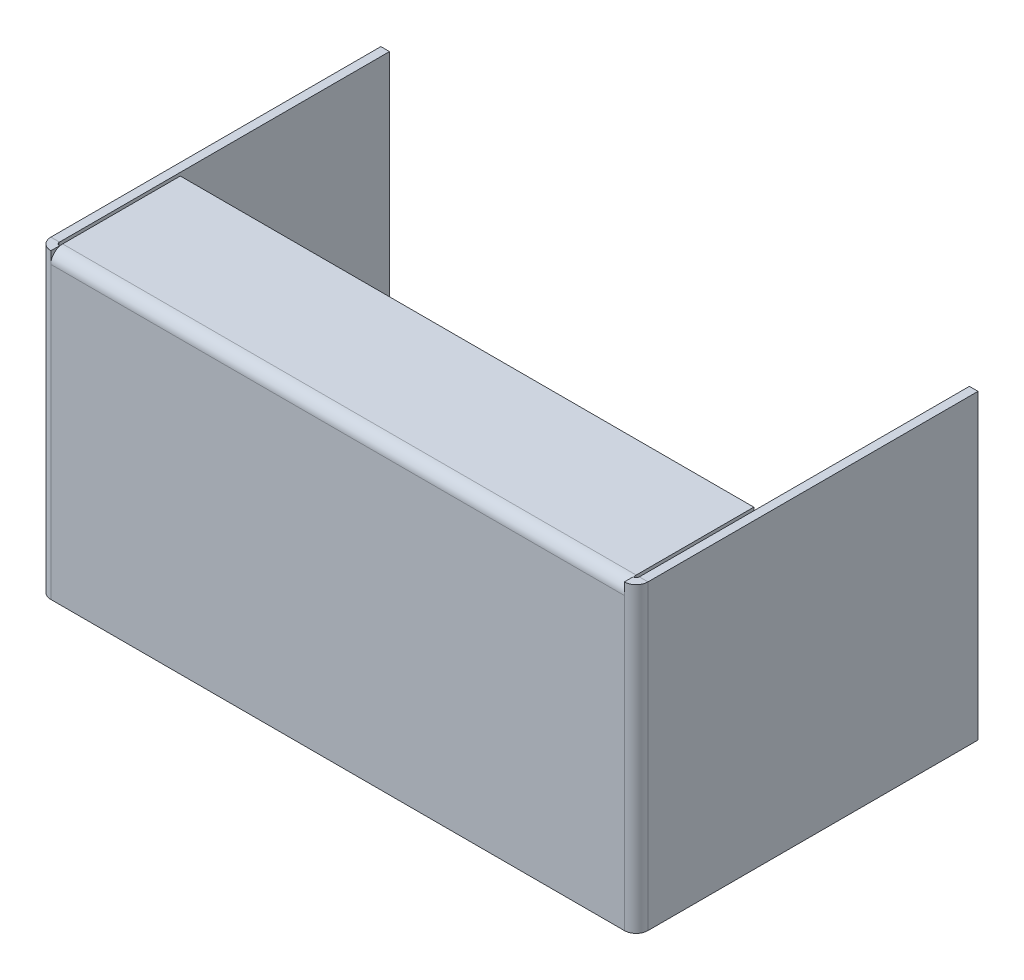
ISO-10303-21;
HEADER;
FILE_DESCRIPTION(('STEP AP214'),'2;1');
FILE_NAME('part.step','',(''),(''),'','','');
FILE_SCHEMA(('AUTOMOTIVE_DESIGN { 1 0 10303 214 1 1 1 1 }'));
ENDSEC;
DATA;
#1=APPLICATION_CONTEXT('core data for automotive mechanical design processes');
#2=APPLICATION_PROTOCOL_DEFINITION('international standard','automotive_design',2000,#1);
#3=PRODUCT_CONTEXT('',#1,'mechanical');
#4=PRODUCT('Part','Part','',(#3));
#5=PRODUCT_RELATED_PRODUCT_CATEGORY('part','',(#4));
#6=PRODUCT_DEFINITION_FORMATION('','',#4);
#7=PRODUCT_DEFINITION_CONTEXT('part definition',#1,'design');
#8=PRODUCT_DEFINITION('design','',#6,#7);
#9=PRODUCT_DEFINITION_SHAPE('','',#8);
#10=(LENGTH_UNIT() NAMED_UNIT(*) SI_UNIT(.MILLI.,.METRE.));
#11=(NAMED_UNIT(*) PLANE_ANGLE_UNIT() SI_UNIT($,.RADIAN.));
#12=(NAMED_UNIT(*) SI_UNIT($,.STERADIAN.) SOLID_ANGLE_UNIT());
#13=UNCERTAINTY_MEASURE_WITH_UNIT(LENGTH_MEASURE(1.E-05),#10,'distance_accuracy_value','');
#14=(GEOMETRIC_REPRESENTATION_CONTEXT(3) GLOBAL_UNCERTAINTY_ASSIGNED_CONTEXT((#13)) GLOBAL_UNIT_ASSIGNED_CONTEXT((#10,
#11,#12)) REPRESENTATION_CONTEXT('',''));
#15=CARTESIAN_POINT('',(0.,0.,0.));
#16=DIRECTION('',(0.,0.,1.));
#17=DIRECTION('',(1.,0.,0.));
#18=AXIS2_PLACEMENT_3D('',#15,#16,#17);
#19=CARTESIAN_POINT('',(133.658162236041,70.,0.));
#20=DIRECTION('',(-1.,0.,0.));
#21=DIRECTION('',(0.,0.,1.));
#22=AXIS2_PLACEMENT_3D('',#19,#20,#21);
#23=PLANE('',#22);
#24=DIRECTION('',(0.,-1.,0.));
#25=VECTOR('',#24,1.);
#26=CARTESIAN_POINT('',(133.658162236041,70.,0.));
#27=LINE('',#26,#25);
#28=CARTESIAN_POINT('',(133.658162236041,70.,0.));
#29=VERTEX_POINT('',#28);
#30=CARTESIAN_POINT('',(133.658162236041,69.8990023979349,0.));
#31=VERTEX_POINT('',#30);
#32=EDGE_CURVE('E245',#29,#31,#27,.T.);
#33=ORIENTED_EDGE('',*,*,#32,.T.);
#34=CARTESIAN_POINT('',(133.658162236041,67.2634,-0.736600000000006));
#35=DIRECTION('',(1.,0.,0.));
#36=DIRECTION('',(0.,0.,-1.));
#37=AXIS2_PLACEMENT_3D('',#34,#35,#36);
#38=CIRCLE('',#37,2.7366);
#39=CARTESIAN_POINT('',(133.658162236041,67.2634,2.));
#40=VERTEX_POINT('',#39);
#41=EDGE_CURVE('E13',#31,#40,#38,.T.);
#42=ORIENTED_EDGE('',*,*,#41,.T.);
#43=DIRECTION('',(0.,-1.,0.));
#44=VECTOR('',#43,1.);
#45=CARTESIAN_POINT('',(133.658162236041,70.,2.));
#46=LINE('',#45,#44);
#47=CARTESIAN_POINT('',(133.658162236041,70.,2.));
#48=VERTEX_POINT('',#47);
#49=EDGE_CURVE('E223',#48,#40,#46,.T.);
#50=ORIENTED_EDGE('',*,*,#49,.F.);
#51=DIRECTION('',(0.,0.,-1.));
#52=VECTOR('',#51,1.);
#53=CARTESIAN_POINT('',(133.658162236041,70.,2.));
#54=LINE('',#53,#52);
#55=EDGE_CURVE('E257',#48,#29,#54,.T.);
#56=ORIENTED_EDGE('',*,*,#55,.T.);
#57=EDGE_LOOP('',(#33,#42,#50,#56));
#58=FACE_BOUND('',#57,.T.);
#59=ADVANCED_FACE('F65',(#58),#23,.T.);
#60=CARTESIAN_POINT('',(0.736600000000004,67.2634,0.));
#61=DIRECTION('',(1.,0.,0.));
#62=DIRECTION('',(0.,1.,0.));
#63=AXIS2_PLACEMENT_3D('',#60,#61,#62);
#64=PLANE('',#63);
#65=DIRECTION('',(0.,-1.,0.));
#66=VECTOR('',#65,1.);
#67=CARTESIAN_POINT('',(0.7366,70.,2.));
#68=LINE('',#67,#66);
#69=CARTESIAN_POINT('',(0.7366,70.,2.));
#70=VERTEX_POINT('',#69);
#71=CARTESIAN_POINT('',(0.736600000000004,67.2634,2.));
#72=VERTEX_POINT('',#71);
#73=EDGE_CURVE('E226',#70,#72,#68,.T.);
#74=ORIENTED_EDGE('',*,*,#73,.T.);
#75=CARTESIAN_POINT('',(0.736600000000004,67.2634,-0.736600000000006));
#76=DIRECTION('',(1.,0.,0.));
#77=DIRECTION('',(0.,0.,-1.));
#78=AXIS2_PLACEMENT_3D('',#75,#76,#77);
#79=CIRCLE('',#78,2.7366);
#80=CARTESIAN_POINT('',(0.736600000000004,69.8990023979349,0.));
#81=VERTEX_POINT('',#80);
#82=EDGE_CURVE('E194',#72,#81,#79,.F.);
#83=ORIENTED_EDGE('',*,*,#82,.T.);
#84=DIRECTION('',(0.,-1.,0.));
#85=VECTOR('',#84,1.);
#86=CARTESIAN_POINT('',(0.7366,70.,0.));
#87=LINE('',#86,#85);
#88=CARTESIAN_POINT('',(0.7366,70.,0.));
#89=VERTEX_POINT('',#88);
#90=EDGE_CURVE('E240',#89,#81,#87,.T.);
#91=ORIENTED_EDGE('',*,*,#90,.F.);
#92=DIRECTION('',(0.,0.,1.));
#93=VECTOR('',#92,1.);
#94=CARTESIAN_POINT('',(0.7366,70.,0.));
#95=LINE('',#94,#93);
#96=EDGE_CURVE('E70',#89,#70,#95,.T.);
#97=ORIENTED_EDGE('',*,*,#96,.T.);
#98=EDGE_LOOP('',(#74,#83,#91,#97));
#99=FACE_BOUND('',#98,.T.);
#100=ADVANCED_FACE('F269',(#99),#64,.T.);
#101=CARTESIAN_POINT('',(0.,70.,0.));
#102=DIRECTION('',(0.,0.,-1.));
#103=DIRECTION('',(-1.,0.,0.));
#104=AXIS2_PLACEMENT_3D('',#101,#102,#103);
#105=PLANE('',#104);
#106=CARTESIAN_POINT('',(0.736600000000004,67.2634,0.));
#107=VERTEX_POINT('',#106);
#108=CARTESIAN_POINT('',(0.7366,0.,0.));
#109=VERTEX_POINT('',#108);
#110=EDGE_CURVE('E238',#107,#109,#87,.T.);
#111=ORIENTED_EDGE('',*,*,#110,.F.);
#112=DIRECTION('',(1.,0.,0.));
#113=VECTOR('',#112,1.);
#114=CARTESIAN_POINT('',(133.658162236041,67.2634,0.));
#115=LINE('',#114,#113);
#116=CARTESIAN_POINT('',(133.658162236041,67.2634,0.));
#117=VERTEX_POINT('',#116);
#118=EDGE_CURVE('E306',#117,#107,#115,.F.);
#119=ORIENTED_EDGE('',*,*,#118,.F.);
#120=CARTESIAN_POINT('',(133.658162236041,0.,0.));
#121=VERTEX_POINT('',#120);
#122=EDGE_CURVE('E237',#117,#121,#27,.T.);
#123=ORIENTED_EDGE('',*,*,#122,.T.);
#124=DIRECTION('',(1.,0.,0.));
#125=VECTOR('',#124,1.);
#126=CARTESIAN_POINT('',(0.,0.,0.));
#127=LINE('',#126,#125);
#128=EDGE_CURVE('E202',#109,#121,#127,.T.);
#129=ORIENTED_EDGE('',*,*,#128,.F.);
#130=EDGE_LOOP('',(#111,#119,#123,#129));
#131=FACE_BOUND('',#130,.T.);
#132=ADVANCED_FACE('F305',(#131),#105,.T.);
#133=CARTESIAN_POINT('',(0.,70.,2.));
#134=DIRECTION('',(0.,0.,-1.));
#135=DIRECTION('',(-1.,0.,0.));
#136=AXIS2_PLACEMENT_3D('',#133,#134,#135);
#137=PLANE('',#136);
#138=DIRECTION('',(1.,0.,0.));
#139=VECTOR('',#138,1.);
#140=CARTESIAN_POINT('',(133.658162236041,67.2634,2.));
#141=LINE('',#140,#139);
#142=EDGE_CURVE('E293',#40,#72,#141,.F.);
#143=ORIENTED_EDGE('',*,*,#142,.T.);
#144=CARTESIAN_POINT('',(0.7366,0.,2.));
#145=VERTEX_POINT('',#144);
#146=EDGE_CURVE('E230',#72,#145,#68,.T.);
#147=ORIENTED_EDGE('',*,*,#146,.T.);
#148=DIRECTION('',(1.,0.,0.));
#149=VECTOR('',#148,1.);
#150=CARTESIAN_POINT('',(0.,0.,2.));
#151=LINE('',#150,#149);
#152=CARTESIAN_POINT('',(133.658162236041,0.,2.));
#153=VERTEX_POINT('',#152);
#154=EDGE_CURVE('E216',#145,#153,#151,.T.);
#155=ORIENTED_EDGE('',*,*,#154,.T.);
#156=EDGE_CURVE('E123',#40,#153,#46,.T.);
#157=ORIENTED_EDGE('',*,*,#156,.F.);
#158=EDGE_LOOP('',(#143,#147,#155,#157));
#159=FACE_BOUND('',#158,.T.);
#160=ADVANCED_FACE('F291',(#159),#137,.F.);
#161=CARTESIAN_POINT('',(0.7366,70.,0.));
#162=DIRECTION('',(0.,1.,0.));
#163=DIRECTION('',(0.,0.,1.));
#164=AXIS2_PLACEMENT_3D('',#161,#162,#163);
#165=PLANE('',#164);
#166=ORIENTED_EDGE('',*,*,#96,.F.);
#167=CARTESIAN_POINT('',(0.7366,70.,-0.736600000000002));
#168=DIRECTION('',(0.,-1.,0.));
#169=DIRECTION('',(0.,0.,-1.));
#170=AXIS2_PLACEMENT_3D('',#167,#168,#169);
#171=CIRCLE('',#170,0.7366);
#172=CARTESIAN_POINT('',(0.,70.,-0.736600000000004));
#173=VERTEX_POINT('',#172);
#174=EDGE_CURVE('E182',#173,#89,#171,.F.);
#175=ORIENTED_EDGE('',*,*,#174,.F.);
#176=DIRECTION('',(1.,0.,0.));
#177=VECTOR('',#176,1.);
#178=CARTESIAN_POINT('',(-2.,70.,-0.736600000000009));
#179=LINE('',#178,#177);
#180=CARTESIAN_POINT('',(-2.,70.,-0.736600000000009));
#181=VERTEX_POINT('',#180);
#182=EDGE_CURVE('E263',#181,#173,#179,.T.);
#183=ORIENTED_EDGE('',*,*,#182,.F.);
#184=CARTESIAN_POINT('',(0.7366,70.,-0.736600000000002));
#185=DIRECTION('',(0.,1.,0.));
#186=DIRECTION('',(1.,0.,0.));
#187=AXIS2_PLACEMENT_3D('',#184,#185,#186);
#188=CIRCLE('',#187,2.7366);
#189=EDGE_CURVE('E173',#181,#70,#188,.T.);
#190=ORIENTED_EDGE('',*,*,#189,.T.);
#191=EDGE_LOOP('',(#166,#175,#183,#190));
#192=FACE_BOUND('',#191,.T.);
#193=ADVANCED_FACE('F62',(#192),#165,.T.);
#194=CARTESIAN_POINT('',(0.,0.,-0.736600000000004));
#195=DIRECTION('',(0.,-1.,0.));
#196=DIRECTION('',(0.,0.,-1.));
#197=AXIS2_PLACEMENT_3D('',#194,#195,#196);
#198=PLANE('',#197);
#199=DIRECTION('',(-1.,0.,0.));
#200=VECTOR('',#199,1.);
#201=CARTESIAN_POINT('',(0.,0.,-0.736600000000004));
#202=LINE('',#201,#200);
#203=CARTESIAN_POINT('',(0.,0.,-0.736600000000004));
#204=VERTEX_POINT('',#203);
#205=CARTESIAN_POINT('',(-2.,0.,-0.736600000000009));
#206=VERTEX_POINT('',#205);
#207=EDGE_CURVE('E265',#204,#206,#202,.T.);
#208=ORIENTED_EDGE('',*,*,#207,.F.);
#209=CARTESIAN_POINT('',(0.7366,0.,-0.736600000000002));
#210=DIRECTION('',(0.,-1.,0.));
#211=DIRECTION('',(0.,0.,-1.));
#212=AXIS2_PLACEMENT_3D('',#209,#210,#211);
#213=CIRCLE('',#212,0.7366);
#214=EDGE_CURVE('E207',#204,#109,#213,.F.);
#215=ORIENTED_EDGE('',*,*,#214,.T.);
#216=DIRECTION('',(0.,0.,-1.));
#217=VECTOR('',#216,1.);
#218=CARTESIAN_POINT('',(0.7366,0.,2.));
#219=LINE('',#218,#217);
#220=EDGE_CURVE('E258',#145,#109,#219,.T.);
#221=ORIENTED_EDGE('',*,*,#220,.F.);
#222=CARTESIAN_POINT('',(0.7366,0.,-0.736600000000002));
#223=DIRECTION('',(0.,1.,0.));
#224=DIRECTION('',(1.,0.,0.));
#225=AXIS2_PLACEMENT_3D('',#222,#223,#224);
#226=CIRCLE('',#225,2.7366);
#227=EDGE_CURVE('E212',#206,#145,#226,.T.);
#228=ORIENTED_EDGE('',*,*,#227,.F.);
#229=EDGE_LOOP('',(#208,#215,#221,#228));
#230=FACE_BOUND('',#229,.T.);
#231=ADVANCED_FACE('F294',(#230),#198,.T.);
#232=CARTESIAN_POINT('',(0.7366,0.,2.));
#233=DIRECTION('',(0.,-1.,0.));
#234=DIRECTION('',(0.,0.,-1.));
#235=AXIS2_PLACEMENT_3D('',#232,#233,#234);
#236=PLANE('',#235);
#237=DIRECTION('',(0.,0.,1.));
#238=VECTOR('',#237,1.);
#239=CARTESIAN_POINT('',(0.,0.,-77.222396617164));
#240=LINE('',#239,#238);
#241=CARTESIAN_POINT('',(0.,0.,-77.222396617164));
#242=VERTEX_POINT('',#241);
#243=EDGE_CURVE('E206',#242,#204,#240,.T.);
#244=ORIENTED_EDGE('',*,*,#243,.T.);
#245=ORIENTED_EDGE('',*,*,#207,.T.);
#246=DIRECTION('',(0.,0.,-1.));
#247=VECTOR('',#246,1.);
#248=CARTESIAN_POINT('',(-2.,0.,-77.222396617164));
#249=LINE('',#248,#247);
#250=CARTESIAN_POINT('',(-2.,0.,-77.222396617164));
#251=VERTEX_POINT('',#250);
#252=EDGE_CURVE('E215',#251,#206,#249,.F.);
#253=ORIENTED_EDGE('',*,*,#252,.F.);
#254=DIRECTION('',(1.,0.,0.));
#255=VECTOR('',#254,1.);
#256=CARTESIAN_POINT('',(-2.,0.,-77.222396617164));
#257=LINE('',#256,#255);
#258=EDGE_CURVE('E164',#251,#242,#257,.T.);
#259=ORIENTED_EDGE('',*,*,#258,.T.);
#260=EDGE_LOOP('',(#244,#245,#253,#259));
#261=FACE_BOUND('',#260,.T.);
#262=ADVANCED_FACE('F384',(#261),#236,.T.);
#263=CARTESIAN_POINT('',(134.394762236041,70.,-0.7366));
#264=DIRECTION('',(0.,1.,0.));
#265=DIRECTION('',(0.,0.,1.));
#266=AXIS2_PLACEMENT_3D('',#263,#264,#265);
#267=PLANE('',#266);
#268=DIRECTION('',(1.,0.,0.));
#269=VECTOR('',#268,1.);
#270=CARTESIAN_POINT('',(134.394762236041,70.,-0.7366));
#271=LINE('',#270,#269);
#272=CARTESIAN_POINT('',(134.394762236041,70.,-0.7366));
#273=VERTEX_POINT('',#272);
#274=CARTESIAN_POINT('',(136.394762236041,70.,-0.7366));
#275=VERTEX_POINT('',#274);
#276=EDGE_CURVE('E82',#273,#275,#271,.T.);
#277=ORIENTED_EDGE('',*,*,#276,.F.);
#278=CARTESIAN_POINT('',(133.658162236041,70.,-0.7366));
#279=DIRECTION('',(0.,-1.,0.));
#280=DIRECTION('',(0.,0.,-1.));
#281=AXIS2_PLACEMENT_3D('',#278,#279,#280);
#282=CIRCLE('',#281,0.7366);
#283=EDGE_CURVE('E319',#29,#273,#282,.F.);
#284=ORIENTED_EDGE('',*,*,#283,.F.);
#285=ORIENTED_EDGE('',*,*,#55,.F.);
#286=CARTESIAN_POINT('',(133.658162236041,70.,-0.7366));
#287=DIRECTION('',(0.,1.,0.));
#288=DIRECTION('',(1.,0.,0.));
#289=AXIS2_PLACEMENT_3D('',#286,#287,#288);
#290=CIRCLE('',#289,2.7366);
#291=EDGE_CURVE('E186',#48,#275,#290,.T.);
#292=ORIENTED_EDGE('',*,*,#291,.T.);
#293=EDGE_LOOP('',(#277,#284,#285,#292));
#294=FACE_BOUND('',#293,.T.);
#295=ADVANCED_FACE('F340',(#294),#267,.T.);
#296=CARTESIAN_POINT('',(133.658162236041,70.,2.));
#297=DIRECTION('',(0.,1.,0.));
#298=DIRECTION('',(0.,0.,1.));
#299=AXIS2_PLACEMENT_3D('',#296,#297,#298);
#300=PLANE('',#299);
#301=DIRECTION('',(0.,0.,-1.));
#302=VECTOR('',#301,1.);
#303=CARTESIAN_POINT('',(134.394762236041,70.,0.));
#304=LINE('',#303,#302);
#305=CARTESIAN_POINT('',(134.394762236041,70.,-77.222396617164));
#306=VERTEX_POINT('',#305);
#307=EDGE_CURVE('E378',#273,#306,#304,.T.);
#308=ORIENTED_EDGE('',*,*,#307,.F.);
#309=ORIENTED_EDGE('',*,*,#276,.T.);
#310=DIRECTION('',(0.,0.,-1.));
#311=VECTOR('',#310,1.);
#312=CARTESIAN_POINT('',(136.394762236041,70.,0.));
#313=LINE('',#312,#311);
#314=CARTESIAN_POINT('',(136.394762236041,70.,-77.222396617164));
#315=VERTEX_POINT('',#314);
#316=EDGE_CURVE('E140',#275,#315,#313,.T.);
#317=ORIENTED_EDGE('',*,*,#316,.T.);
#318=DIRECTION('',(1.,0.,0.));
#319=VECTOR('',#318,1.);
#320=CARTESIAN_POINT('',(134.394762236041,70.,-77.222396617164));
#321=LINE('',#320,#319);
#322=EDGE_CURVE('E374',#306,#315,#321,.T.);
#323=ORIENTED_EDGE('',*,*,#322,.F.);
#324=EDGE_LOOP('',(#308,#309,#317,#323));
#325=FACE_BOUND('',#324,.T.);
#326=ADVANCED_FACE('F393',(#325),#300,.T.);
#327=CARTESIAN_POINT('',(133.658162236041,0.,0.));
#328=DIRECTION('',(0.,-1.,0.));
#329=DIRECTION('',(0.,0.,-1.));
#330=AXIS2_PLACEMENT_3D('',#327,#328,#329);
#331=PLANE('',#330);
#332=DIRECTION('',(0.,0.,1.));
#333=VECTOR('',#332,1.);
#334=CARTESIAN_POINT('',(133.658162236041,0.,0.));
#335=LINE('',#334,#333);
#336=EDGE_CURVE('E253',#121,#153,#335,.T.);
#337=ORIENTED_EDGE('',*,*,#336,.F.);
#338=CARTESIAN_POINT('',(133.658162236041,0.,-0.7366));
#339=DIRECTION('',(0.,-1.,0.));
#340=DIRECTION('',(0.,0.,-1.));
#341=AXIS2_PLACEMENT_3D('',#338,#339,#340);
#342=CIRCLE('',#341,0.7366);
#343=CARTESIAN_POINT('',(134.394762236041,0.,-0.7366));
#344=VERTEX_POINT('',#343);
#345=EDGE_CURVE('E201',#121,#344,#342,.F.);
#346=ORIENTED_EDGE('',*,*,#345,.T.);
#347=DIRECTION('',(-1.,0.,0.));
#348=VECTOR('',#347,1.);
#349=CARTESIAN_POINT('',(136.394762236041,0.,-0.7366));
#350=LINE('',#349,#348);
#351=CARTESIAN_POINT('',(136.394762236041,0.,-0.7366));
#352=VERTEX_POINT('',#351);
#353=EDGE_CURVE('E132',#352,#344,#350,.T.);
#354=ORIENTED_EDGE('',*,*,#353,.F.);
#355=CARTESIAN_POINT('',(133.658162236041,0.,-0.7366));
#356=DIRECTION('',(0.,1.,0.));
#357=DIRECTION('',(1.,0.,0.));
#358=AXIS2_PLACEMENT_3D('',#355,#356,#357);
#359=CIRCLE('',#358,2.7366);
#360=EDGE_CURVE('E222',#153,#352,#359,.T.);
#361=ORIENTED_EDGE('',*,*,#360,.F.);
#362=EDGE_LOOP('',(#337,#346,#354,#361));
#363=FACE_BOUND('',#362,.T.);
#364=ADVANCED_FACE('F315',(#363),#331,.T.);
#365=CARTESIAN_POINT('',(136.394762236041,0.,-0.7366));
#366=DIRECTION('',(0.,-1.,0.));
#367=DIRECTION('',(0.,0.,-1.));
#368=AXIS2_PLACEMENT_3D('',#365,#366,#367);
#369=PLANE('',#368);
#370=ORIENTED_EDGE('',*,*,#128,.T.);
#371=ORIENTED_EDGE('',*,*,#336,.T.);
#372=ORIENTED_EDGE('',*,*,#154,.F.);
#373=ORIENTED_EDGE('',*,*,#220,.T.);
#374=EDGE_LOOP('',(#370,#371,#372,#373));
#375=FACE_BOUND('',#374,.T.);
#376=ADVANCED_FACE('F297',(#375),#369,.T.);
#377=CARTESIAN_POINT('',(136.394762236041,70.,0.));
#378=DIRECTION('',(-1.,0.,0.));
#379=DIRECTION('',(0.,0.,1.));
#380=AXIS2_PLACEMENT_3D('',#377,#378,#379);
#381=PLANE('',#380);
#382=DIRECTION('',(0.,0.,-1.));
#383=VECTOR('',#382,1.);
#384=CARTESIAN_POINT('',(136.394762236041,0.,0.));
#385=LINE('',#384,#383);
#386=CARTESIAN_POINT('',(136.394762236041,0.,-77.222396617164));
#387=VERTEX_POINT('',#386);
#388=EDGE_CURVE('E191',#352,#387,#385,.T.);
#389=ORIENTED_EDGE('',*,*,#388,.T.);
#390=DIRECTION('',(0.,-1.,0.));
#391=VECTOR('',#390,1.);
#392=CARTESIAN_POINT('',(136.394762236041,70.,-77.222396617164));
#393=LINE('',#392,#391);
#394=EDGE_CURVE('E251',#315,#387,#393,.T.);
#395=ORIENTED_EDGE('',*,*,#394,.F.);
#396=ORIENTED_EDGE('',*,*,#316,.F.);
#397=DIRECTION('',(0.,-1.,0.));
#398=VECTOR('',#397,1.);
#399=CARTESIAN_POINT('',(136.394762236041,70.,-0.7366));
#400=LINE('',#399,#398);
#401=EDGE_CURVE('E187',#275,#352,#400,.T.);
#402=ORIENTED_EDGE('',*,*,#401,.T.);
#403=EDGE_LOOP('',(#389,#395,#396,#402));
#404=FACE_BOUND('',#403,.T.);
#405=ADVANCED_FACE('F327',(#404),#381,.F.);
#406=CARTESIAN_POINT('',(134.394762236041,70.,-77.222396617164));
#407=DIRECTION('',(0.,0.,-1.));
#408=DIRECTION('',(-1.,0.,0.));
#409=AXIS2_PLACEMENT_3D('',#406,#407,#408);
#410=PLANE('',#409);
#411=DIRECTION('',(1.,0.,0.));
#412=VECTOR('',#411,1.);
#413=CARTESIAN_POINT('',(134.394762236041,0.,-77.222396617164));
#414=LINE('',#413,#412);
#415=CARTESIAN_POINT('',(134.394762236041,0.,-77.222396617164));
#416=VERTEX_POINT('',#415);
#417=EDGE_CURVE('E192',#416,#387,#414,.T.);
#418=ORIENTED_EDGE('',*,*,#417,.F.);
#419=DIRECTION('',(0.,-1.,0.));
#420=VECTOR('',#419,1.);
#421=CARTESIAN_POINT('',(134.394762236041,70.,-77.222396617164));
#422=LINE('',#421,#420);
#423=EDGE_CURVE('E247',#306,#416,#422,.T.);
#424=ORIENTED_EDGE('',*,*,#423,.F.);
#425=ORIENTED_EDGE('',*,*,#322,.T.);
#426=ORIENTED_EDGE('',*,*,#394,.T.);
#427=EDGE_LOOP('',(#418,#424,#425,#426));
#428=FACE_BOUND('',#427,.T.);
#429=ADVANCED_FACE('F426',(#428),#410,.T.);
#430=CARTESIAN_POINT('',(134.394762236041,70.,0.));
#431=DIRECTION('',(-1.,0.,0.));
#432=DIRECTION('',(0.,0.,1.));
#433=AXIS2_PLACEMENT_3D('',#430,#431,#432);
#434=PLANE('',#433);
#435=DIRECTION('',(0.,0.,-1.));
#436=VECTOR('',#435,1.);
#437=CARTESIAN_POINT('',(134.394762236041,0.,0.));
#438=LINE('',#437,#436);
#439=EDGE_CURVE('E198',#344,#416,#438,.T.);
#440=ORIENTED_EDGE('',*,*,#439,.F.);
#441=DIRECTION('',(0.,-1.,0.));
#442=VECTOR('',#441,1.);
#443=CARTESIAN_POINT('',(134.394762236041,70.,-0.7366));
#444=LINE('',#443,#442);
#445=EDGE_CURVE('E244',#273,#344,#444,.T.);
#446=ORIENTED_EDGE('',*,*,#445,.F.);
#447=ORIENTED_EDGE('',*,*,#307,.T.);
#448=ORIENTED_EDGE('',*,*,#423,.T.);
#449=EDGE_LOOP('',(#440,#446,#447,#448));
#450=FACE_BOUND('',#449,.T.);
#451=ADVANCED_FACE('F321',(#450),#434,.T.);
#452=CARTESIAN_POINT('',(133.658162236041,70.,-0.7366));
#453=DIRECTION('',(0.,-1.,0.));
#454=DIRECTION('',(0.,0.,-1.));
#455=AXIS2_PLACEMENT_3D('',#452,#453,#454);
#456=CYLINDRICAL_SURFACE('',#455,0.7366);
#457=ORIENTED_EDGE('',*,*,#345,.F.);
#458=ORIENTED_EDGE('',*,*,#122,.F.);
#459=EDGE_CURVE('E246',#31,#117,#27,.T.);
#460=ORIENTED_EDGE('',*,*,#459,.F.);
#461=ORIENTED_EDGE('',*,*,#32,.F.);
#462=ORIENTED_EDGE('',*,*,#283,.T.);
#463=ORIENTED_EDGE('',*,*,#445,.T.);
#464=EDGE_LOOP('',(#457,#458,#460,#461,#462,#463));
#465=FACE_BOUND('',#464,.T.);
#466=ADVANCED_FACE('F313',(#465),#456,.F.);
#467=CARTESIAN_POINT('',(0.7366,70.,-0.736600000000002));
#468=DIRECTION('',(0.,-1.,0.));
#469=DIRECTION('',(0.,0.,-1.));
#470=AXIS2_PLACEMENT_3D('',#467,#468,#469);
#471=CYLINDRICAL_SURFACE('',#470,0.7366);
#472=ORIENTED_EDGE('',*,*,#214,.F.);
#473=DIRECTION('',(0.,-1.,0.));
#474=VECTOR('',#473,1.);
#475=CARTESIAN_POINT('',(0.,70.,-0.736600000000004));
#476=LINE('',#475,#474);
#477=EDGE_CURVE('E231',#173,#204,#476,.T.);
#478=ORIENTED_EDGE('',*,*,#477,.F.);
#479=ORIENTED_EDGE('',*,*,#174,.T.);
#480=ORIENTED_EDGE('',*,*,#90,.T.);
#481=EDGE_CURVE('E241',#81,#107,#87,.T.);
#482=ORIENTED_EDGE('',*,*,#481,.T.);
#483=ORIENTED_EDGE('',*,*,#110,.T.);
#484=EDGE_LOOP('',(#472,#478,#479,#480,#482,#483));
#485=FACE_BOUND('',#484,.T.);
#486=ADVANCED_FACE('F377',(#485),#471,.F.);
#487=CARTESIAN_POINT('',(0.,70.,-77.222396617164));
#488=DIRECTION('',(1.,0.,0.));
#489=DIRECTION('',(0.,0.,-1.));
#490=AXIS2_PLACEMENT_3D('',#487,#488,#489);
#491=PLANE('',#490);
#492=ORIENTED_EDGE('',*,*,#243,.F.);
#493=DIRECTION('',(0.,-1.,0.));
#494=VECTOR('',#493,1.);
#495=CARTESIAN_POINT('',(0.,70.,-77.222396617164));
#496=LINE('',#495,#494);
#497=CARTESIAN_POINT('',(0.,70.,-77.222396617164));
#498=VERTEX_POINT('',#497);
#499=EDGE_CURVE('E162',#498,#242,#496,.T.);
#500=ORIENTED_EDGE('',*,*,#499,.F.);
#501=DIRECTION('',(0.,0.,1.));
#502=VECTOR('',#501,1.);
#503=CARTESIAN_POINT('',(0.,70.,-77.222396617164));
#504=LINE('',#503,#502);
#505=EDGE_CURVE('E179',#498,#173,#504,.T.);
#506=ORIENTED_EDGE('',*,*,#505,.T.);
#507=ORIENTED_EDGE('',*,*,#477,.T.);
#508=EDGE_LOOP('',(#492,#500,#506,#507));
#509=FACE_BOUND('',#508,.T.);
#510=ADVANCED_FACE('F381',(#509),#491,.T.);
#511=CARTESIAN_POINT('',(-2.,70.,-77.222396617164));
#512=DIRECTION('',(0.,0.,-1.));
#513=DIRECTION('',(-1.,0.,0.));
#514=AXIS2_PLACEMENT_3D('',#511,#512,#513);
#515=PLANE('',#514);
#516=ORIENTED_EDGE('',*,*,#258,.F.);
#517=DIRECTION('',(0.,-1.,0.));
#518=VECTOR('',#517,1.);
#519=CARTESIAN_POINT('',(-2.,70.,-77.222396617164));
#520=LINE('',#519,#518);
#521=CARTESIAN_POINT('',(-2.,70.,-77.222396617164));
#522=VERTEX_POINT('',#521);
#523=EDGE_CURVE('E154',#522,#251,#520,.T.);
#524=ORIENTED_EDGE('',*,*,#523,.F.);
#525=DIRECTION('',(1.,0.,0.));
#526=VECTOR('',#525,1.);
#527=CARTESIAN_POINT('',(-2.,70.,-77.222396617164));
#528=LINE('',#527,#526);
#529=EDGE_CURVE('E156',#522,#498,#528,.T.);
#530=ORIENTED_EDGE('',*,*,#529,.T.);
#531=ORIENTED_EDGE('',*,*,#499,.T.);
#532=EDGE_LOOP('',(#516,#524,#530,#531));
#533=FACE_BOUND('',#532,.T.);
#534=ADVANCED_FACE('F160',(#533),#515,.T.);
#535=CARTESIAN_POINT('',(-2.,70.,-77.222396617164));
#536=DIRECTION('',(1.,0.,0.));
#537=DIRECTION('',(0.,0.,-1.));
#538=AXIS2_PLACEMENT_3D('',#535,#536,#537);
#539=PLANE('',#538);
#540=ORIENTED_EDGE('',*,*,#252,.T.);
#541=DIRECTION('',(0.,-1.,0.));
#542=VECTOR('',#541,1.);
#543=CARTESIAN_POINT('',(-2.,70.,-0.736600000000009));
#544=LINE('',#543,#542);
#545=EDGE_CURVE('E168',#181,#206,#544,.T.);
#546=ORIENTED_EDGE('',*,*,#545,.F.);
#547=DIRECTION('',(0.,0.,-1.));
#548=VECTOR('',#547,1.);
#549=CARTESIAN_POINT('',(-2.,70.,-77.222396617164));
#550=LINE('',#549,#548);
#551=EDGE_CURVE('E169',#522,#181,#550,.F.);
#552=ORIENTED_EDGE('',*,*,#551,.F.);
#553=ORIENTED_EDGE('',*,*,#523,.T.);
#554=EDGE_LOOP('',(#540,#546,#552,#553));
#555=FACE_BOUND('',#554,.T.);
#556=ADVANCED_FACE('F172',(#555),#539,.F.);
#557=CARTESIAN_POINT('',(0.7366,70.,-0.736600000000002));
#558=DIRECTION('',(0.,-1.,0.));
#559=DIRECTION('',(0.,0.,-1.));
#560=AXIS2_PLACEMENT_3D('',#557,#558,#559);
#561=CYLINDRICAL_SURFACE('',#560,2.7366);
#562=ORIENTED_EDGE('',*,*,#227,.T.);
#563=ORIENTED_EDGE('',*,*,#146,.F.);
#564=ORIENTED_EDGE('',*,*,#73,.F.);
#565=ORIENTED_EDGE('',*,*,#189,.F.);
#566=ORIENTED_EDGE('',*,*,#545,.T.);
#567=EDGE_LOOP('',(#562,#563,#564,#565,#566));
#568=FACE_BOUND('',#567,.T.);
#569=ADVANCED_FACE('F282',(#568),#561,.T.);
#570=CARTESIAN_POINT('',(133.658162236041,70.,-0.7366));
#571=DIRECTION('',(0.,-1.,0.));
#572=DIRECTION('',(0.,0.,-1.));
#573=AXIS2_PLACEMENT_3D('',#570,#571,#572);
#574=CYLINDRICAL_SURFACE('',#573,2.7366);
#575=ORIENTED_EDGE('',*,*,#360,.T.);
#576=ORIENTED_EDGE('',*,*,#401,.F.);
#577=ORIENTED_EDGE('',*,*,#291,.F.);
#578=ORIENTED_EDGE('',*,*,#49,.T.);
#579=ORIENTED_EDGE('',*,*,#156,.T.);
#580=EDGE_LOOP('',(#575,#576,#577,#578,#579));
#581=FACE_BOUND('',#580,.T.);
#582=ADVANCED_FACE('F331',(#581),#574,.T.);
#583=CARTESIAN_POINT('',(133.658162236041,70.,-0.7366));
#584=DIRECTION('',(0.,-1.,0.));
#585=DIRECTION('',(-1.,0.,0.));
#586=AXIS2_PLACEMENT_3D('',#583,#584,#585);
#587=PLANE('',#586);
#588=ORIENTED_EDGE('',*,*,#551,.T.);
#589=ORIENTED_EDGE('',*,*,#182,.T.);
#590=ORIENTED_EDGE('',*,*,#505,.F.);
#591=ORIENTED_EDGE('',*,*,#529,.F.);
#592=EDGE_LOOP('',(#588,#589,#590,#591));
#593=FACE_BOUND('',#592,.T.);
#594=ADVANCED_FACE('F176',(#593),#587,.F.);
#595=CARTESIAN_POINT('',(133.658162236041,0.,-0.7366));
#596=DIRECTION('',(0.,-1.,0.));
#597=DIRECTION('',(-1.,0.,0.));
#598=AXIS2_PLACEMENT_3D('',#595,#596,#597);
#599=PLANE('',#598);
#600=ORIENTED_EDGE('',*,*,#388,.F.);
#601=ORIENTED_EDGE('',*,*,#353,.T.);
#602=ORIENTED_EDGE('',*,*,#439,.T.);
#603=ORIENTED_EDGE('',*,*,#417,.T.);
#604=EDGE_LOOP('',(#600,#601,#602,#603));
#605=FACE_BOUND('',#604,.T.);
#606=ADVANCED_FACE('F330',(#605),#599,.T.);
#607=CARTESIAN_POINT('',(0.736600000000004,67.2634,-0.736600000000006));
#608=DIRECTION('',(-1.,0.,0.));
#609=DIRECTION('',(0.,0.,1.));
#610=AXIS2_PLACEMENT_3D('',#607,#608,#609);
#611=PLANE('',#610);
#612=ORIENTED_EDGE('',*,*,#481,.F.);
#613=CARTESIAN_POINT('',(0.736600000000004,70.,-0.736599999999997));
#614=VERTEX_POINT('',#613);
#615=EDGE_CURVE('E756',#81,#614,#79,.F.);
#616=ORIENTED_EDGE('',*,*,#615,.T.);
#617=DIRECTION('',(0.,-1.,0.));
#618=VECTOR('',#617,1.);
#619=CARTESIAN_POINT('',(0.7366,70.,-0.736599999999997));
#620=LINE('',#619,#618);
#621=CARTESIAN_POINT('',(0.736600000000004,68.,-0.736600000000004));
#622=VERTEX_POINT('',#621);
#623=EDGE_CURVE('E757',#622,#614,#620,.F.);
#624=ORIENTED_EDGE('',*,*,#623,.F.);
#625=CARTESIAN_POINT('',(0.736600000000004,67.2634,-0.736600000000006));
#626=DIRECTION('',(1.,0.,0.));
#627=DIRECTION('',(0.,0.,-1.));
#628=AXIS2_PLACEMENT_3D('',#625,#626,#627);
#629=CIRCLE('',#628,0.736600000000004);
#630=EDGE_CURVE('E368',#107,#622,#629,.F.);
#631=ORIENTED_EDGE('',*,*,#630,.F.);
#632=EDGE_LOOP('',(#612,#616,#624,#631));
#633=FACE_BOUND('',#632,.T.);
#634=ADVANCED_FACE('F410',(#633),#611,.T.);
#635=CARTESIAN_POINT('',(133.658162236041,67.2634,-0.736600000000006));
#636=DIRECTION('',(-1.,0.,0.));
#637=DIRECTION('',(0.,0.,1.));
#638=AXIS2_PLACEMENT_3D('',#635,#636,#637);
#639=PLANE('',#638);
#640=CARTESIAN_POINT('',(133.658162236041,70.,-0.736599999999997));
#641=VERTEX_POINT('',#640);
#642=EDGE_CURVE('E74',#641,#31,#38,.T.);
#643=ORIENTED_EDGE('',*,*,#642,.T.);
#644=ORIENTED_EDGE('',*,*,#459,.T.);
#645=CARTESIAN_POINT('',(133.658162236041,67.2634,-0.736600000000006));
#646=DIRECTION('',(1.,0.,0.));
#647=DIRECTION('',(0.,0.,-1.));
#648=AXIS2_PLACEMENT_3D('',#645,#646,#647);
#649=CIRCLE('',#648,0.736600000000004);
#650=CARTESIAN_POINT('',(133.658162236041,68.,-0.736600000000004));
#651=VERTEX_POINT('',#650);
#652=EDGE_CURVE('E355',#651,#117,#649,.T.);
#653=ORIENTED_EDGE('',*,*,#652,.F.);
#654=DIRECTION('',(0.,-1.,0.));
#655=VECTOR('',#654,1.);
#656=CARTESIAN_POINT('',(133.658162236041,68.,-0.736600000000004));
#657=LINE('',#656,#655);
#658=EDGE_CURVE('E751',#651,#641,#657,.F.);
#659=ORIENTED_EDGE('',*,*,#658,.T.);
#660=EDGE_LOOP('',(#643,#644,#653,#659));
#661=FACE_BOUND('',#660,.T.);
#662=ADVANCED_FACE('F347',(#661),#639,.F.);
#663=CARTESIAN_POINT('',(133.658162236041,67.2634,-0.736600000000006));
#664=DIRECTION('',(1.,0.,0.));
#665=DIRECTION('',(0.,1.,0.));
#666=AXIS2_PLACEMENT_3D('',#663,#664,#665);
#667=CYLINDRICAL_SURFACE('',#666,2.7366);
#668=ORIENTED_EDGE('',*,*,#142,.F.);
#669=ORIENTED_EDGE('',*,*,#41,.F.);
#670=ORIENTED_EDGE('',*,*,#642,.F.);
#671=DIRECTION('',(1.,0.,0.));
#672=VECTOR('',#671,1.);
#673=CARTESIAN_POINT('',(0.7366,70.,-0.736599999999997));
#674=LINE('',#673,#672);
#675=EDGE_CURVE('E746',#641,#614,#674,.F.);
#676=ORIENTED_EDGE('',*,*,#675,.T.);
#677=ORIENTED_EDGE('',*,*,#615,.F.);
#678=ORIENTED_EDGE('',*,*,#82,.F.);
#679=EDGE_LOOP('',(#668,#669,#670,#676,#677,#678));
#680=FACE_BOUND('',#679,.T.);
#681=ADVANCED_FACE('F537',(#680),#667,.T.);
#682=CARTESIAN_POINT('',(133.658162236041,67.2634,-0.736600000000006));
#683=DIRECTION('',(1.,0.,0.));
#684=DIRECTION('',(0.,1.,0.));
#685=AXIS2_PLACEMENT_3D('',#682,#683,#684);
#686=CYLINDRICAL_SURFACE('',#685,0.736600000000004);
#687=ORIENTED_EDGE('',*,*,#118,.T.);
#688=ORIENTED_EDGE('',*,*,#630,.T.);
#689=DIRECTION('',(1.,0.,0.));
#690=VECTOR('',#689,1.);
#691=CARTESIAN_POINT('',(0.7366,68.,-0.736600000000004));
#692=LINE('',#691,#690);
#693=EDGE_CURVE('E365',#622,#651,#692,.T.);
#694=ORIENTED_EDGE('',*,*,#693,.T.);
#695=ORIENTED_EDGE('',*,*,#652,.T.);
#696=EDGE_LOOP('',(#687,#688,#694,#695));
#697=FACE_BOUND('',#696,.T.);
#698=ADVANCED_FACE('F356',(#697),#686,.F.);
#699=CARTESIAN_POINT('',(0.7366,70.,0.));
#700=DIRECTION('',(1.,0.,0.));
#701=DIRECTION('',(0.,0.,-1.));
#702=AXIS2_PLACEMENT_3D('',#699,#700,#701);
#703=PLANE('',#702);
#704=ORIENTED_EDGE('',*,*,#623,.T.);
#705=DIRECTION('',(0.,0.,1.));
#706=VECTOR('',#705,1.);
#707=CARTESIAN_POINT('',(0.7366,70.,2.49844249314439E-13));
#708=LINE('',#707,#706);
#709=CARTESIAN_POINT('',(0.7366,70.0000000000001,-28.));
#710=VERTEX_POINT('',#709);
#711=EDGE_CURVE('E738',#710,#614,#708,.T.);
#712=ORIENTED_EDGE('',*,*,#711,.F.);
#713=DIRECTION('',(0.,-1.,0.));
#714=VECTOR('',#713,1.);
#715=CARTESIAN_POINT('',(0.7366,70.0000000000001,-28.));
#716=LINE('',#715,#714);
#717=CARTESIAN_POINT('',(0.7366,68.0000000000001,-28.));
#718=VERTEX_POINT('',#717);
#719=EDGE_CURVE('E367',#710,#718,#716,.T.);
#720=ORIENTED_EDGE('',*,*,#719,.T.);
#721=DIRECTION('',(0.,0.,-1.));
#722=VECTOR('',#721,1.);
#723=CARTESIAN_POINT('',(0.7366,68.,0.));
#724=LINE('',#723,#722);
#725=EDGE_CURVE('E745',#718,#622,#724,.F.);
#726=ORIENTED_EDGE('',*,*,#725,.T.);
#727=EDGE_LOOP('',(#704,#712,#720,#726));
#728=FACE_BOUND('',#727,.T.);
#729=ADVANCED_FACE('F556',(#728),#703,.F.);
#730=CARTESIAN_POINT('',(133.658162236041,70.0000000000001,-28.));
#731=DIRECTION('',(-1.,0.,0.));
#732=DIRECTION('',(0.,0.,1.));
#733=AXIS2_PLACEMENT_3D('',#730,#731,#732);
#734=PLANE('',#733);
#735=ORIENTED_EDGE('',*,*,#658,.F.);
#736=DIRECTION('',(0.,0.,1.));
#737=VECTOR('',#736,1.);
#738=CARTESIAN_POINT('',(133.658162236041,68.0000000000001,-28.));
#739=LINE('',#738,#737);
#740=CARTESIAN_POINT('',(133.658162236041,68.0000000000001,-28.));
#741=VERTEX_POINT('',#740);
#742=EDGE_CURVE('E740',#651,#741,#739,.F.);
#743=ORIENTED_EDGE('',*,*,#742,.T.);
#744=DIRECTION('',(0.,-1.,0.));
#745=VECTOR('',#744,1.);
#746=CARTESIAN_POINT('',(133.658162236041,70.0000000000001,-28.));
#747=LINE('',#746,#745);
#748=CARTESIAN_POINT('',(133.658162236041,70.0000000000001,-28.));
#749=VERTEX_POINT('',#748);
#750=EDGE_CURVE('E363',#749,#741,#747,.T.);
#751=ORIENTED_EDGE('',*,*,#750,.F.);
#752=DIRECTION('',(0.,0.,-1.));
#753=VECTOR('',#752,1.);
#754=CARTESIAN_POINT('',(133.658162236041,70.,2.49844249314439E-13));
#755=LINE('',#754,#753);
#756=EDGE_CURVE('E779',#641,#749,#755,.T.);
#757=ORIENTED_EDGE('',*,*,#756,.F.);
#758=EDGE_LOOP('',(#735,#743,#751,#757));
#759=FACE_BOUND('',#758,.T.);
#760=ADVANCED_FACE('F567',(#759),#734,.F.);
#761=CARTESIAN_POINT('',(0.,70.,2.49844249314439E-13));
#762=DIRECTION('',(0.,-1.,0.));
#763=DIRECTION('',(0.,0.,-1.));
#764=AXIS2_PLACEMENT_3D('',#761,#762,#763);
#765=PLANE('',#764);
#766=ORIENTED_EDGE('',*,*,#675,.F.);
#767=ORIENTED_EDGE('',*,*,#756,.T.);
#768=DIRECTION('',(-1.,0.,0.));
#769=VECTOR('',#768,1.);
#770=CARTESIAN_POINT('',(0.,70.0000000000001,-28.));
#771=LINE('',#770,#769);
#772=EDGE_CURVE('E742',#749,#710,#771,.T.);
#773=ORIENTED_EDGE('',*,*,#772,.T.);
#774=ORIENTED_EDGE('',*,*,#711,.T.);
#775=EDGE_LOOP('',(#766,#767,#773,#774));
#776=FACE_BOUND('',#775,.T.);
#777=ADVANCED_FACE('F579',(#776),#765,.F.);
#778=CARTESIAN_POINT('',(0.,68.,2.42861286636753E-13));
#779=DIRECTION('',(0.,-1.,0.));
#780=DIRECTION('',(0.,0.,-1.));
#781=AXIS2_PLACEMENT_3D('',#778,#779,#780);
#782=PLANE('',#781);
#783=ORIENTED_EDGE('',*,*,#742,.F.);
#784=ORIENTED_EDGE('',*,*,#693,.F.);
#785=ORIENTED_EDGE('',*,*,#725,.F.);
#786=DIRECTION('',(1.,0.,0.));
#787=VECTOR('',#786,1.);
#788=CARTESIAN_POINT('',(0.7366,68.0000000000001,-28.));
#789=LINE('',#788,#787);
#790=EDGE_CURVE('E723',#741,#718,#789,.F.);
#791=ORIENTED_EDGE('',*,*,#790,.F.);
#792=EDGE_LOOP('',(#783,#784,#785,#791));
#793=FACE_BOUND('',#792,.T.);
#794=ADVANCED_FACE('F591',(#793),#782,.T.);
#795=CARTESIAN_POINT('',(0.7366,70.0000000000001,-28.));
#796=DIRECTION('',(0.,0.,1.));
#797=DIRECTION('',(0.,-1.,0.));
#798=AXIS2_PLACEMENT_3D('',#795,#796,#797);
#799=PLANE('',#798);
#800=ORIENTED_EDGE('',*,*,#790,.T.);
#801=ORIENTED_EDGE('',*,*,#719,.F.);
#802=ORIENTED_EDGE('',*,*,#772,.F.);
#803=ORIENTED_EDGE('',*,*,#750,.T.);
#804=EDGE_LOOP('',(#800,#801,#802,#803));
#805=FACE_BOUND('',#804,.T.);
#806=ADVANCED_FACE('F605',(#805),#799,.F.);
#807=CLOSED_SHELL('',(#59,#100,#132,#160,#193,#231,#262,#295,#326,#364,#376,#405,#429,#451,#466,
#486,#510,#534,#556,#569,#582,#594,#606,#634,#662,#681,#698,#729,#760,#777,#794,#806));
#808=MANIFOLD_SOLID_BREP('B2',#807);
#809=ADVANCED_BREP_SHAPE_REPRESENTATION('',(#18,#808),#14);
#810=SHAPE_DEFINITION_REPRESENTATION(#9,#809);
ENDSEC;
END-ISO-10303-21;
